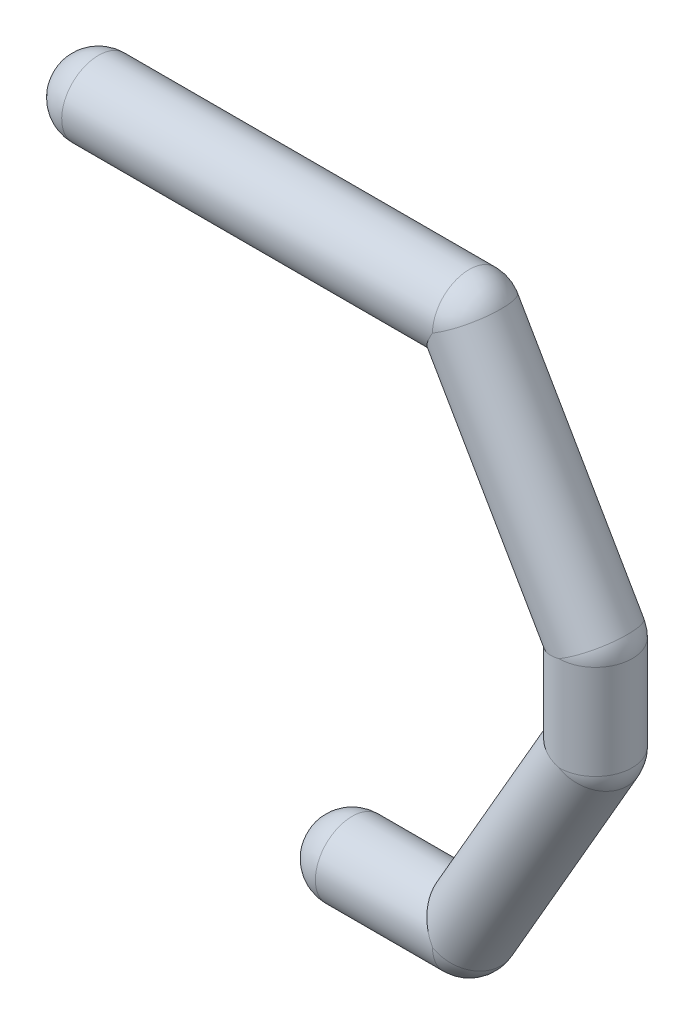
ISO-10303-21;
HEADER;
FILE_DESCRIPTION(('STEP AP214'),'2;1');
FILE_NAME('part.step','',(''),(''),'','','');
FILE_SCHEMA(('AUTOMOTIVE_DESIGN { 1 0 10303 214 1 1 1 1 }'));
ENDSEC;
DATA;
#1=APPLICATION_CONTEXT('core data for automotive mechanical design processes');
#2=APPLICATION_PROTOCOL_DEFINITION('international standard','automotive_design',2000,#1);
#3=PRODUCT_CONTEXT('',#1,'mechanical');
#4=PRODUCT('Part','Part','',(#3));
#5=PRODUCT_RELATED_PRODUCT_CATEGORY('part','',(#4));
#6=PRODUCT_DEFINITION_FORMATION('','',#4);
#7=PRODUCT_DEFINITION_CONTEXT('part definition',#1,'design');
#8=PRODUCT_DEFINITION('design','',#6,#7);
#9=PRODUCT_DEFINITION_SHAPE('','',#8);
#10=(LENGTH_UNIT() NAMED_UNIT(*) SI_UNIT(.MILLI.,.METRE.));
#11=(NAMED_UNIT(*) PLANE_ANGLE_UNIT() SI_UNIT($,.RADIAN.));
#12=(NAMED_UNIT(*) SI_UNIT($,.STERADIAN.) SOLID_ANGLE_UNIT());
#13=UNCERTAINTY_MEASURE_WITH_UNIT(LENGTH_MEASURE(1.E-05),#10,'distance_accuracy_value','');
#14=(GEOMETRIC_REPRESENTATION_CONTEXT(3) GLOBAL_UNCERTAINTY_ASSIGNED_CONTEXT((#13)) GLOBAL_UNIT_ASSIGNED_CONTEXT((#10,
#11,#12)) REPRESENTATION_CONTEXT('',''));
#15=CARTESIAN_POINT('',(0.,0.,0.));
#16=DIRECTION('',(0.,0.,1.));
#17=DIRECTION('',(1.,0.,0.));
#18=AXIS2_PLACEMENT_3D('',#15,#16,#17);
#19=CARTESIAN_POINT('',(20.4,-13.08,1.125));
#20=DIRECTION('',(1.,0.,0.));
#21=DIRECTION('',(0.,-1.,0.));
#22=AXIS2_PLACEMENT_3D('',#19,#20,#21);
#23=SPHERICAL_SURFACE('',#22,0.24);
#24=CARTESIAN_POINT('',(20.4,-13.08,1.125));
#25=DIRECTION('',(-1.,0.,0.));
#26=DIRECTION('',(0.,0.,1.));
#27=AXIS2_PLACEMENT_3D('',#24,#25,#26);
#28=CIRCLE('',#27,0.24);
#29=CARTESIAN_POINT('',(20.4,-13.08,1.365));
#30=VERTEX_POINT('',#29);
#31=EDGE_CURVE('E70',#30,#30,#28,.F.);
#32=ORIENTED_EDGE('',*,*,#31,.F.);
#33=EDGE_LOOP('',(#32));
#34=FACE_BOUND('',#33,.T.);
#35=ADVANCED_FACE('F63',(#34),#23,.T.);
#36=CARTESIAN_POINT('',(21.166,-13.08,1.125));
#37=DIRECTION('',(-1.,0.,0.));
#38=DIRECTION('',(0.,0.,1.));
#39=AXIS2_PLACEMENT_3D('',#36,#37,#38);
#40=CYLINDRICAL_SURFACE('',#39,0.24);
#41=CARTESIAN_POINT('',(21.166,-13.08,1.125));
#42=DIRECTION('',(-0.866000737383216,-0.50004272102664,0.));
#43=DIRECTION('',(-0.500042721026639,0.866000737383216,0.));
#44=AXIS2_PLACEMENT_3D('',#41,#42,#43);
#45=ELLIPSE('',#44,0.277136022684236,0.24);
#46=CARTESIAN_POINT('',(21.166,-13.08,0.885));
#47=VERTEX_POINT('',#46);
#48=CARTESIAN_POINT('',(21.166,-13.08,1.365));
#49=VERTEX_POINT('',#48);
#50=EDGE_CURVE('E12',#47,#49,#45,.F.);
#51=ORIENTED_EDGE('',*,*,#50,.F.);
#52=CARTESIAN_POINT('',(21.166,-13.08,1.125));
#53=DIRECTION('',(-1.,0.,0.));
#54=DIRECTION('',(0.,0.,1.));
#55=AXIS2_PLACEMENT_3D('',#52,#53,#54);
#56=CIRCLE('',#55,0.24);
#57=EDGE_CURVE('E77',#47,#49,#56,.T.);
#58=ORIENTED_EDGE('',*,*,#57,.T.);
#59=EDGE_LOOP('',(#51,#58));
#60=FACE_BOUND('',#59,.T.);
#61=ORIENTED_EDGE('',*,*,#31,.T.);
#62=EDGE_LOOP('',(#61));
#63=FACE_BOUND('',#62,.T.);
#64=ADVANCED_FACE('F137',(#60,#63),#40,.T.);
#65=CARTESIAN_POINT('',(21.166,-13.08,1.125));
#66=DIRECTION('',(1.,0.,0.));
#67=DIRECTION('',(0.,-1.,0.));
#68=AXIS2_PLACEMENT_3D('',#65,#66,#67);
#69=SPHERICAL_SURFACE('',#68,0.24);
#70=ORIENTED_EDGE('',*,*,#57,.F.);
#71=CARTESIAN_POINT('',(21.166,-13.08,1.125));
#72=DIRECTION('',(-0.499914554296549,-0.86607473026436,0.));
#73=DIRECTION('',(0.86607473026436,-0.499914554296549,0.));
#74=AXIS2_PLACEMENT_3D('',#71,#72,#73);
#75=CIRCLE('',#74,0.24);
#76=EDGE_CURVE('E128',#49,#47,#75,.F.);
#77=ORIENTED_EDGE('',*,*,#76,.F.);
#78=EDGE_LOOP('',(#70,#77));
#79=FACE_BOUND('',#78,.T.);
#80=ADVANCED_FACE('F143',(#79),#69,.T.);
#81=CARTESIAN_POINT('',(21.992,-11.649,1.125));
#82=DIRECTION('',(-0.499914554296549,-0.86607473026436,0.));
#83=DIRECTION('',(0.86607473026436,-0.499914554296549,0.));
#84=AXIS2_PLACEMENT_3D('',#81,#82,#83);
#85=CYLINDRICAL_SURFACE('',#84,0.24);
#86=CARTESIAN_POINT('',(21.992,-11.649,1.125));
#87=DIRECTION('',(-0.258771394995313,-0.965938592837132,0.));
#88=DIRECTION('',(-0.965938592837132,0.258771394995313,0.));
#89=AXIS2_PLACEMENT_3D('',#86,#87,#88);
#90=ELLIPSE('',#89,0.248462999387029,0.24);
#91=CARTESIAN_POINT('',(21.992,-11.649,0.885));
#92=VERTEX_POINT('',#91);
#93=CARTESIAN_POINT('',(21.992,-11.649,1.365));
#94=VERTEX_POINT('',#93);
#95=EDGE_CURVE('E131',#92,#94,#90,.F.);
#96=ORIENTED_EDGE('',*,*,#95,.F.);
#97=CARTESIAN_POINT('',(21.992,-11.649,1.125));
#98=DIRECTION('',(-0.499914554296552,-0.866074730264358,0.));
#99=DIRECTION('',(0.866074730264358,-0.499914554296552,0.));
#100=AXIS2_PLACEMENT_3D('',#97,#98,#99);
#101=CIRCLE('',#100,0.24);
#102=EDGE_CURVE('E126',#92,#94,#101,.T.);
#103=ORIENTED_EDGE('',*,*,#102,.T.);
#104=EDGE_LOOP('',(#96,#103));
#105=FACE_BOUND('',#104,.T.);
#106=ORIENTED_EDGE('',*,*,#76,.T.);
#107=ORIENTED_EDGE('',*,*,#50,.T.);
#108=EDGE_LOOP('',(#106,#107));
#109=FACE_BOUND('',#108,.T.);
#110=ADVANCED_FACE('F147',(#105,#109),#85,.T.);
#111=CARTESIAN_POINT('',(21.992,-11.649,1.125));
#112=DIRECTION('',(1.,0.,0.));
#113=DIRECTION('',(0.,-1.,0.));
#114=AXIS2_PLACEMENT_3D('',#111,#112,#113);
#115=SPHERICAL_SURFACE('',#114,0.24);
#116=ORIENTED_EDGE('',*,*,#102,.F.);
#117=CARTESIAN_POINT('',(21.992,-11.649,1.125));
#118=DIRECTION('',(0.,-1.,0.));
#119=DIRECTION('',(0.,0.,-1.));
#120=AXIS2_PLACEMENT_3D('',#117,#118,#119);
#121=CIRCLE('',#120,0.24);
#122=EDGE_CURVE('E116',#94,#92,#121,.F.);
#123=ORIENTED_EDGE('',*,*,#122,.F.);
#124=EDGE_LOOP('',(#116,#123));
#125=FACE_BOUND('',#124,.T.);
#126=ADVANCED_FACE('F153',(#125),#115,.T.);
#127=CARTESIAN_POINT('',(21.992,-11.031,1.125));
#128=DIRECTION('',(0.,-1.,0.));
#129=DIRECTION('',(0.,0.,-1.));
#130=AXIS2_PLACEMENT_3D('',#127,#128,#129);
#131=CYLINDRICAL_SURFACE('',#130,0.240000000000001);
#132=CARTESIAN_POINT('',(21.992,-11.031,1.125));
#133=DIRECTION('',(0.258771394995313,-0.965938592837133,0.));
#134=DIRECTION('',(-0.965938592837133,-0.258771394995312,0.));
#135=AXIS2_PLACEMENT_3D('',#132,#133,#134);
#136=ELLIPSE('',#135,0.248462999387029,0.24);
#137=CARTESIAN_POINT('',(21.992,-11.031,0.884999999999999));
#138=VERTEX_POINT('',#137);
#139=CARTESIAN_POINT('',(21.992,-11.031,1.365));
#140=VERTEX_POINT('',#139);
#141=EDGE_CURVE('E123',#138,#140,#136,.F.);
#142=ORIENTED_EDGE('',*,*,#141,.F.);
#143=CARTESIAN_POINT('',(21.992,-11.031,1.125));
#144=DIRECTION('',(0.,-1.,0.));
#145=DIRECTION('',(0.,0.,-1.));
#146=AXIS2_PLACEMENT_3D('',#143,#144,#145);
#147=CIRCLE('',#146,0.240000000000001);
#148=EDGE_CURVE('E114',#138,#140,#147,.T.);
#149=ORIENTED_EDGE('',*,*,#148,.T.);
#150=EDGE_LOOP('',(#142,#149));
#151=FACE_BOUND('',#150,.T.);
#152=ORIENTED_EDGE('',*,*,#122,.T.);
#153=ORIENTED_EDGE('',*,*,#95,.T.);
#154=EDGE_LOOP('',(#152,#153));
#155=FACE_BOUND('',#154,.T.);
#156=ADVANCED_FACE('F157',(#151,#155),#131,.T.);
#157=CARTESIAN_POINT('',(21.992,-11.031,1.125));
#158=DIRECTION('',(1.,0.,0.));
#159=DIRECTION('',(0.,-1.,0.));
#160=AXIS2_PLACEMENT_3D('',#157,#158,#159);
#161=SPHERICAL_SURFACE('',#160,0.24);
#162=ORIENTED_EDGE('',*,*,#148,.F.);
#163=CARTESIAN_POINT('',(21.992,-11.031,1.125));
#164=DIRECTION('',(0.499914554296548,-0.86607473026436,0.));
#165=DIRECTION('',(0.86607473026436,0.499914554296548,0.));
#166=AXIS2_PLACEMENT_3D('',#163,#164,#165);
#167=CIRCLE('',#166,0.24);
#168=EDGE_CURVE('E104',#140,#138,#167,.F.);
#169=ORIENTED_EDGE('',*,*,#168,.F.);
#170=EDGE_LOOP('',(#162,#169));
#171=FACE_BOUND('',#170,.T.);
#172=ADVANCED_FACE('F161',(#171),#161,.T.);
#173=CARTESIAN_POINT('',(21.166,-9.6,1.125));
#174=DIRECTION('',(0.499914554296548,-0.86607473026436,0.));
#175=DIRECTION('',(0.86607473026436,0.499914554296548,0.));
#176=AXIS2_PLACEMENT_3D('',#173,#174,#175);
#177=CYLINDRICAL_SURFACE('',#176,0.24);
#178=CARTESIAN_POINT('',(21.166,-9.6,1.125));
#179=DIRECTION('',(0.866000737383216,-0.50004272102664,0.));
#180=DIRECTION('',(-0.500042721026639,-0.866000737383216,0.));
#181=AXIS2_PLACEMENT_3D('',#178,#179,#180);
#182=ELLIPSE('',#181,0.277136022684236,0.24);
#183=CARTESIAN_POINT('',(21.166,-9.6,0.885));
#184=VERTEX_POINT('',#183);
#185=CARTESIAN_POINT('',(21.166,-9.6,1.365));
#186=VERTEX_POINT('',#185);
#187=EDGE_CURVE('E109',#184,#186,#182,.F.);
#188=ORIENTED_EDGE('',*,*,#187,.F.);
#189=CARTESIAN_POINT('',(21.166,-9.6,1.125));
#190=DIRECTION('',(0.499914554296551,-0.866074730264358,0.));
#191=DIRECTION('',(0.866074730264358,0.499914554296551,0.));
#192=AXIS2_PLACEMENT_3D('',#189,#190,#191);
#193=CIRCLE('',#192,0.24);
#194=EDGE_CURVE('E97',#184,#186,#193,.T.);
#195=ORIENTED_EDGE('',*,*,#194,.T.);
#196=EDGE_LOOP('',(#188,#195));
#197=FACE_BOUND('',#196,.T.);
#198=ORIENTED_EDGE('',*,*,#168,.T.);
#199=ORIENTED_EDGE('',*,*,#141,.T.);
#200=EDGE_LOOP('',(#198,#199));
#201=FACE_BOUND('',#200,.T.);
#202=ADVANCED_FACE('F112',(#197,#201),#177,.T.);
#203=CARTESIAN_POINT('',(21.166,-9.6,1.125));
#204=DIRECTION('',(1.,0.,0.));
#205=DIRECTION('',(0.,-1.,0.));
#206=AXIS2_PLACEMENT_3D('',#203,#204,#205);
#207=SPHERICAL_SURFACE('',#206,0.24);
#208=ORIENTED_EDGE('',*,*,#194,.F.);
#209=CARTESIAN_POINT('',(21.166,-9.6,1.125));
#210=DIRECTION('',(1.,0.,0.));
#211=DIRECTION('',(0.,0.,-1.));
#212=AXIS2_PLACEMENT_3D('',#209,#210,#211);
#213=CIRCLE('',#212,0.24);
#214=EDGE_CURVE('E100',#184,#186,#213,.T.);
#215=ORIENTED_EDGE('',*,*,#214,.T.);
#216=EDGE_LOOP('',(#208,#215));
#217=FACE_BOUND('',#216,.T.);
#218=ADVANCED_FACE('F99',(#217),#207,.T.);
#219=CARTESIAN_POINT('',(18.741,-9.6,1.125));
#220=DIRECTION('',(1.,0.,0.));
#221=DIRECTION('',(0.,0.,-1.));
#222=AXIS2_PLACEMENT_3D('',#219,#220,#221);
#223=CYLINDRICAL_SURFACE('',#222,0.24);
#224=ORIENTED_EDGE('',*,*,#214,.F.);
#225=ORIENTED_EDGE('',*,*,#187,.T.);
#226=EDGE_LOOP('',(#224,#225));
#227=FACE_BOUND('',#226,.T.);
#228=CARTESIAN_POINT('',(18.741,-9.6,1.125));
#229=DIRECTION('',(1.,0.,0.));
#230=DIRECTION('',(0.,0.,-1.));
#231=AXIS2_PLACEMENT_3D('',#228,#229,#230);
#232=CIRCLE('',#231,0.24);
#233=CARTESIAN_POINT('',(18.741,-9.6,0.885));
#234=VERTEX_POINT('',#233);
#235=EDGE_CURVE('E110',#234,#234,#232,.T.);
#236=ORIENTED_EDGE('',*,*,#235,.T.);
#237=EDGE_LOOP('',(#236));
#238=FACE_BOUND('',#237,.T.);
#239=ADVANCED_FACE('F107',(#227,#238),#223,.T.);
#240=CARTESIAN_POINT('',(18.741,-9.6,1.125));
#241=DIRECTION('',(1.,0.,0.));
#242=DIRECTION('',(0.,-1.,0.));
#243=AXIS2_PLACEMENT_3D('',#240,#241,#242);
#244=SPHERICAL_SURFACE('',#243,0.24);
#245=ORIENTED_EDGE('',*,*,#235,.F.);
#246=EDGE_LOOP('',(#245));
#247=FACE_BOUND('',#246,.T.);
#248=ADVANCED_FACE('F168',(#247),#244,.T.);
#249=CLOSED_SHELL('',(#35,#64,#80,#110,#126,#156,#172,#202,#218,#239,#248));
#250=MANIFOLD_SOLID_BREP('B2',#249);
#251=ADVANCED_BREP_SHAPE_REPRESENTATION('',(#18,#250),#14);
#252=SHAPE_DEFINITION_REPRESENTATION(#9,#251);
ENDSEC;
END-ISO-10303-21;
